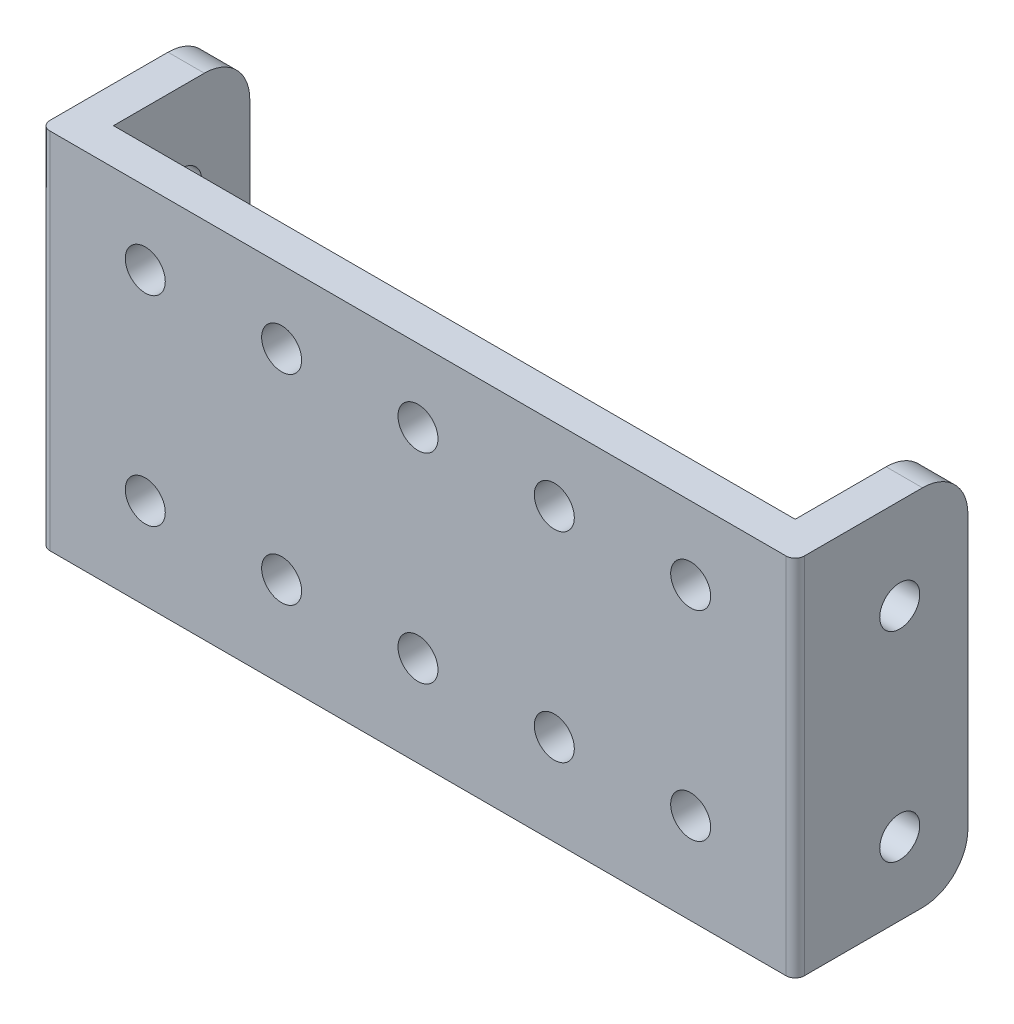
ISO-10303-21;
HEADER;
FILE_DESCRIPTION(('STEP AP214'),'2;1');
FILE_NAME('part.step','',(''),(''),'','','');
FILE_SCHEMA(('AUTOMOTIVE_DESIGN { 1 0 10303 214 1 1 1 1 }'));
ENDSEC;
DATA;
#1=APPLICATION_CONTEXT('core data for automotive mechanical design processes');
#2=APPLICATION_PROTOCOL_DEFINITION('international standard','automotive_design',2000,#1);
#3=PRODUCT_CONTEXT('',#1,'mechanical');
#4=PRODUCT('Part','Part','',(#3));
#5=PRODUCT_RELATED_PRODUCT_CATEGORY('part','',(#4));
#6=PRODUCT_DEFINITION_FORMATION('','',#4);
#7=PRODUCT_DEFINITION_CONTEXT('part definition',#1,'design');
#8=PRODUCT_DEFINITION('design','',#6,#7);
#9=PRODUCT_DEFINITION_SHAPE('','',#8);
#10=(LENGTH_UNIT() NAMED_UNIT(*) SI_UNIT(.MILLI.,.METRE.));
#11=(NAMED_UNIT(*) PLANE_ANGLE_UNIT() SI_UNIT($,.RADIAN.));
#12=(NAMED_UNIT(*) SI_UNIT($,.STERADIAN.) SOLID_ANGLE_UNIT());
#13=UNCERTAINTY_MEASURE_WITH_UNIT(LENGTH_MEASURE(1.E-05),#10,'distance_accuracy_value','');
#14=(GEOMETRIC_REPRESENTATION_CONTEXT(3) GLOBAL_UNCERTAINTY_ASSIGNED_CONTEXT((#13)) GLOBAL_UNIT_ASSIGNED_CONTEXT((#10,
#11,#12)) REPRESENTATION_CONTEXT('',''));
#15=CARTESIAN_POINT('',(0.,0.,0.));
#16=DIRECTION('',(0.,0.,1.));
#17=DIRECTION('',(1.,0.,0.));
#18=AXIS2_PLACEMENT_3D('',#15,#16,#17);
#19=CARTESIAN_POINT('',(-41.5,40.,-15.));
#20=DIRECTION('',(0.,0.,1.));
#21=DIRECTION('',(1.,0.,0.));
#22=AXIS2_PLACEMENT_3D('',#19,#20,#21);
#23=PLANE('',#22);
#24=DIRECTION('',(0.,-1.,0.));
#25=VECTOR('',#24,1.);
#26=CARTESIAN_POINT('',(-37.5,40.,-15.));
#27=LINE('',#26,#25);
#28=CARTESIAN_POINT('',(-37.5,35.,-15.));
#29=VERTEX_POINT('',#28);
#30=CARTESIAN_POINT('',(-37.5,5.,-15.));
#31=VERTEX_POINT('',#30);
#32=EDGE_CURVE('E178',#29,#31,#27,.T.);
#33=ORIENTED_EDGE('',*,*,#32,.T.);
#34=DIRECTION('',(-1.,0.,0.));
#35=VECTOR('',#34,1.);
#36=CARTESIAN_POINT('',(-41.5,5.,-15.));
#37=LINE('',#36,#35);
#38=CARTESIAN_POINT('',(-41.5,5.,-15.));
#39=VERTEX_POINT('',#38);
#40=EDGE_CURVE('E219',#31,#39,#37,.T.);
#41=ORIENTED_EDGE('',*,*,#40,.T.);
#42=DIRECTION('',(0.,-1.,0.));
#43=VECTOR('',#42,1.);
#44=CARTESIAN_POINT('',(-41.5,40.,-15.));
#45=LINE('',#44,#43);
#46=CARTESIAN_POINT('',(-41.5,35.,-15.));
#47=VERTEX_POINT('',#46);
#48=EDGE_CURVE('E156',#47,#39,#45,.T.);
#49=ORIENTED_EDGE('',*,*,#48,.F.);
#50=DIRECTION('',(-1.,0.,0.));
#51=VECTOR('',#50,1.);
#52=CARTESIAN_POINT('',(-41.5,35.,-15.));
#53=LINE('',#52,#51);
#54=EDGE_CURVE('E217',#47,#29,#53,.F.);
#55=ORIENTED_EDGE('',*,*,#54,.T.);
#56=EDGE_LOOP('',(#33,#41,#49,#55));
#57=FACE_BOUND('',#56,.T.);
#58=ADVANCED_FACE('F33',(#57),#23,.F.);
#59=CARTESIAN_POINT('',(-41.5,40.,3.00000000000001));
#60=DIRECTION('',(1.,0.,0.));
#61=DIRECTION('',(0.,0.,-1.));
#62=AXIS2_PLACEMENT_3D('',#59,#60,#61);
#63=PLANE('',#62);
#64=CARTESIAN_POINT('',(-41.5,30.,-7.49999999999999));
#65=DIRECTION('',(-1.,0.,0.));
#66=DIRECTION('',(0.,0.,1.));
#67=AXIS2_PLACEMENT_3D('',#64,#65,#66);
#68=CIRCLE('',#67,2.2);
#69=CARTESIAN_POINT('',(-41.5,30.,-5.29999999999999));
#70=VERTEX_POINT('',#69);
#71=EDGE_CURVE('E279',#70,#70,#68,.T.);
#72=ORIENTED_EDGE('',*,*,#71,.F.);
#73=EDGE_LOOP('',(#72));
#74=FACE_BOUND('',#73,.T.);
#75=CARTESIAN_POINT('',(-41.5,8.,-7.49999999999999));
#76=DIRECTION('',(-1.,0.,0.));
#77=DIRECTION('',(0.,0.,1.));
#78=AXIS2_PLACEMENT_3D('',#75,#76,#77);
#79=CIRCLE('',#78,2.2);
#80=CARTESIAN_POINT('',(-41.5,8.,-5.29999999999999));
#81=VERTEX_POINT('',#80);
#82=EDGE_CURVE('E286',#81,#81,#79,.T.);
#83=ORIENTED_EDGE('',*,*,#82,.F.);
#84=EDGE_LOOP('',(#83));
#85=FACE_BOUND('',#84,.T.);
#86=ORIENTED_EDGE('',*,*,#48,.T.);
#87=CARTESIAN_POINT('',(-41.5,5.,-9.99999999999999));
#88=DIRECTION('',(1.,0.,0.));
#89=DIRECTION('',(0.,0.,-1.));
#90=AXIS2_PLACEMENT_3D('',#87,#88,#89);
#91=CIRCLE('',#90,5.);
#92=CARTESIAN_POINT('',(-41.5,0.,-9.99999999999999));
#93=VERTEX_POINT('',#92);
#94=EDGE_CURVE('E224',#39,#93,#91,.F.);
#95=ORIENTED_EDGE('',*,*,#94,.T.);
#96=DIRECTION('',(0.,0.,1.));
#97=VECTOR('',#96,1.);
#98=CARTESIAN_POINT('',(-41.5,0.,3.00000000000001));
#99=LINE('',#98,#97);
#100=CARTESIAN_POINT('',(-41.5,0.,3.00000000000001));
#101=VERTEX_POINT('',#100);
#102=EDGE_CURVE('E153',#93,#101,#99,.T.);
#103=ORIENTED_EDGE('',*,*,#102,.T.);
#104=DIRECTION('',(0.,-1.,0.));
#105=VECTOR('',#104,1.);
#106=CARTESIAN_POINT('',(-41.5,40.,3.00000000000001));
#107=LINE('',#106,#105);
#108=CARTESIAN_POINT('',(-41.5,40.,3.00000000000001));
#109=VERTEX_POINT('',#108);
#110=EDGE_CURVE('E149',#109,#101,#107,.T.);
#111=ORIENTED_EDGE('',*,*,#110,.F.);
#112=DIRECTION('',(0.,0.,1.));
#113=VECTOR('',#112,1.);
#114=CARTESIAN_POINT('',(-41.5,40.,3.00000000000001));
#115=LINE('',#114,#113);
#116=CARTESIAN_POINT('',(-41.5,40.,-9.99999999999999));
#117=VERTEX_POINT('',#116);
#118=EDGE_CURVE('E136',#117,#109,#115,.T.);
#119=ORIENTED_EDGE('',*,*,#118,.F.);
#120=CARTESIAN_POINT('',(-41.5,35.,-9.99999999999999));
#121=DIRECTION('',(1.,0.,0.));
#122=DIRECTION('',(0.,0.,-1.));
#123=AXIS2_PLACEMENT_3D('',#120,#121,#122);
#124=CIRCLE('',#123,5.);
#125=EDGE_CURVE('E222',#117,#47,#124,.F.);
#126=ORIENTED_EDGE('',*,*,#125,.T.);
#127=EDGE_LOOP('',(#86,#95,#103,#111,#119,#126));
#128=FACE_BOUND('',#127,.T.);
#129=ADVANCED_FACE('F151',(#74,#85,#128),#63,.F.);
#130=CARTESIAN_POINT('',(-40.5,40.,3.00000000000001));
#131=DIRECTION('',(0.,-1.,0.));
#132=DIRECTION('',(0.,0.,-1.));
#133=AXIS2_PLACEMENT_3D('',#130,#131,#132);
#134=CYLINDRICAL_SURFACE('',#133,1.);
#135=CARTESIAN_POINT('',(-40.5,0.,3.00000000000001));
#136=DIRECTION('',(0.,1.,0.));
#137=DIRECTION('',(0.,0.,-1.));
#138=AXIS2_PLACEMENT_3D('',#135,#136,#137);
#139=CIRCLE('',#138,1.);
#140=CARTESIAN_POINT('',(-40.5,0.,4.00000000000001));
#141=VERTEX_POINT('',#140);
#142=EDGE_CURVE('E180',#101,#141,#139,.T.);
#143=ORIENTED_EDGE('',*,*,#142,.T.);
#144=DIRECTION('',(0.,-1.,0.));
#145=VECTOR('',#144,1.);
#146=CARTESIAN_POINT('',(-40.5,40.,4.00000000000001));
#147=LINE('',#146,#145);
#148=CARTESIAN_POINT('',(-40.5,40.,4.00000000000001));
#149=VERTEX_POINT('',#148);
#150=EDGE_CURVE('E157',#149,#141,#147,.T.);
#151=ORIENTED_EDGE('',*,*,#150,.F.);
#152=CARTESIAN_POINT('',(-40.5,40.,3.00000000000001));
#153=DIRECTION('',(0.,1.,0.));
#154=DIRECTION('',(0.,0.,-1.));
#155=AXIS2_PLACEMENT_3D('',#152,#153,#154);
#156=CIRCLE('',#155,1.);
#157=EDGE_CURVE('E141',#109,#149,#156,.T.);
#158=ORIENTED_EDGE('',*,*,#157,.F.);
#159=ORIENTED_EDGE('',*,*,#110,.T.);
#160=EDGE_LOOP('',(#143,#151,#158,#159));
#161=FACE_BOUND('',#160,.T.);
#162=ADVANCED_FACE('F159',(#161),#134,.T.);
#163=CARTESIAN_POINT('',(40.5,40.,3.99999999999998));
#164=DIRECTION('',(0.,0.,-1.));
#165=DIRECTION('',(-1.,0.,0.));
#166=AXIS2_PLACEMENT_3D('',#163,#164,#165);
#167=PLANE('',#166);
#168=CARTESIAN_POINT('',(-15.,32.,3.99999999999999));
#169=DIRECTION('',(0.,0.,1.));
#170=DIRECTION('',(1.,0.,0.));
#171=AXIS2_PLACEMENT_3D('',#168,#169,#170);
#172=CIRCLE('',#171,2.2);
#173=CARTESIAN_POINT('',(-12.8,32.,3.99999999999999));
#174=VERTEX_POINT('',#173);
#175=EDGE_CURVE('E305',#174,#174,#172,.T.);
#176=ORIENTED_EDGE('',*,*,#175,.F.);
#177=EDGE_LOOP('',(#176));
#178=FACE_BOUND('',#177,.T.);
#179=CARTESIAN_POINT('',(0.,32.,3.99999999999999));
#180=DIRECTION('',(0.,0.,1.));
#181=DIRECTION('',(1.,0.,0.));
#182=AXIS2_PLACEMENT_3D('',#179,#180,#181);
#183=CIRCLE('',#182,2.2);
#184=CARTESIAN_POINT('',(2.2,32.,3.99999999999999));
#185=VERTEX_POINT('',#184);
#186=EDGE_CURVE('E308',#185,#185,#183,.T.);
#187=ORIENTED_EDGE('',*,*,#186,.F.);
#188=EDGE_LOOP('',(#187));
#189=FACE_BOUND('',#188,.T.);
#190=CARTESIAN_POINT('',(15.,32.,3.99999999999999));
#191=DIRECTION('',(0.,0.,1.));
#192=DIRECTION('',(1.,0.,0.));
#193=AXIS2_PLACEMENT_3D('',#190,#191,#192);
#194=CIRCLE('',#193,2.2);
#195=CARTESIAN_POINT('',(17.2,32.,3.99999999999999));
#196=VERTEX_POINT('',#195);
#197=EDGE_CURVE('E311',#196,#196,#194,.T.);
#198=ORIENTED_EDGE('',*,*,#197,.F.);
#199=EDGE_LOOP('',(#198));
#200=FACE_BOUND('',#199,.T.);
#201=CARTESIAN_POINT('',(30.,32.,3.99999999999999));
#202=DIRECTION('',(0.,0.,1.));
#203=DIRECTION('',(1.,0.,0.));
#204=AXIS2_PLACEMENT_3D('',#201,#202,#203);
#205=CIRCLE('',#204,2.2);
#206=CARTESIAN_POINT('',(32.2,32.,3.99999999999999));
#207=VERTEX_POINT('',#206);
#208=EDGE_CURVE('E314',#207,#207,#205,.T.);
#209=ORIENTED_EDGE('',*,*,#208,.F.);
#210=EDGE_LOOP('',(#209));
#211=FACE_BOUND('',#210,.T.);
#212=CARTESIAN_POINT('',(-30.,10.,3.99999999999999));
#213=DIRECTION('',(0.,0.,1.));
#214=DIRECTION('',(1.,0.,0.));
#215=AXIS2_PLACEMENT_3D('',#212,#213,#214);
#216=CIRCLE('',#215,2.2);
#217=CARTESIAN_POINT('',(-27.8,10.,3.99999999999999));
#218=VERTEX_POINT('',#217);
#219=EDGE_CURVE('E317',#218,#218,#216,.T.);
#220=ORIENTED_EDGE('',*,*,#219,.F.);
#221=EDGE_LOOP('',(#220));
#222=FACE_BOUND('',#221,.T.);
#223=CARTESIAN_POINT('',(-15.,10.,3.99999999999999));
#224=DIRECTION('',(0.,0.,1.));
#225=DIRECTION('',(1.,0.,0.));
#226=AXIS2_PLACEMENT_3D('',#223,#224,#225);
#227=CIRCLE('',#226,2.2);
#228=CARTESIAN_POINT('',(-12.8,10.,3.99999999999999));
#229=VERTEX_POINT('',#228);
#230=EDGE_CURVE('E320',#229,#229,#227,.T.);
#231=ORIENTED_EDGE('',*,*,#230,.F.);
#232=EDGE_LOOP('',(#231));
#233=FACE_BOUND('',#232,.T.);
#234=CARTESIAN_POINT('',(0.,10.,3.99999999999999));
#235=DIRECTION('',(0.,0.,1.));
#236=DIRECTION('',(1.,0.,0.));
#237=AXIS2_PLACEMENT_3D('',#234,#235,#236);
#238=CIRCLE('',#237,2.2);
#239=CARTESIAN_POINT('',(2.2,10.,3.99999999999999));
#240=VERTEX_POINT('',#239);
#241=EDGE_CURVE('E323',#240,#240,#238,.T.);
#242=ORIENTED_EDGE('',*,*,#241,.F.);
#243=EDGE_LOOP('',(#242));
#244=FACE_BOUND('',#243,.T.);
#245=CARTESIAN_POINT('',(15.,10.,3.99999999999999));
#246=DIRECTION('',(0.,0.,1.));
#247=DIRECTION('',(1.,0.,0.));
#248=AXIS2_PLACEMENT_3D('',#245,#246,#247);
#249=CIRCLE('',#248,2.2);
#250=CARTESIAN_POINT('',(17.2,10.,3.99999999999999));
#251=VERTEX_POINT('',#250);
#252=EDGE_CURVE('E304',#251,#251,#249,.T.);
#253=ORIENTED_EDGE('',*,*,#252,.F.);
#254=EDGE_LOOP('',(#253));
#255=FACE_BOUND('',#254,.T.);
#256=CARTESIAN_POINT('',(30.,10.,3.99999999999999));
#257=DIRECTION('',(0.,0.,1.));
#258=DIRECTION('',(1.,0.,0.));
#259=AXIS2_PLACEMENT_3D('',#256,#257,#258);
#260=CIRCLE('',#259,2.2);
#261=CARTESIAN_POINT('',(32.2,10.,3.99999999999999));
#262=VERTEX_POINT('',#261);
#263=EDGE_CURVE('E301',#262,#262,#260,.T.);
#264=ORIENTED_EDGE('',*,*,#263,.F.);
#265=EDGE_LOOP('',(#264));
#266=FACE_BOUND('',#265,.T.);
#267=CARTESIAN_POINT('',(-30.,32.,3.99999999999999));
#268=DIRECTION('',(0.,0.,1.));
#269=DIRECTION('',(1.,0.,0.));
#270=AXIS2_PLACEMENT_3D('',#267,#268,#269);
#271=CIRCLE('',#270,2.2);
#272=CARTESIAN_POINT('',(-27.8,32.,3.99999999999999));
#273=VERTEX_POINT('',#272);
#274=EDGE_CURVE('E251',#273,#273,#271,.T.);
#275=ORIENTED_EDGE('',*,*,#274,.F.);
#276=EDGE_LOOP('',(#275));
#277=FACE_BOUND('',#276,.T.);
#278=DIRECTION('',(1.,0.,0.));
#279=VECTOR('',#278,1.);
#280=CARTESIAN_POINT('',(40.5,0.,3.99999999999998));
#281=LINE('',#280,#279);
#282=CARTESIAN_POINT('',(40.5,0.,3.99999999999998));
#283=VERTEX_POINT('',#282);
#284=EDGE_CURVE('E183',#141,#283,#281,.T.);
#285=ORIENTED_EDGE('',*,*,#284,.T.);
#286=DIRECTION('',(0.,-1.,0.));
#287=VECTOR('',#286,1.);
#288=CARTESIAN_POINT('',(40.5,40.,3.99999999999998));
#289=LINE('',#288,#287);
#290=CARTESIAN_POINT('',(40.5,40.,3.99999999999998));
#291=VERTEX_POINT('',#290);
#292=EDGE_CURVE('E212',#291,#283,#289,.T.);
#293=ORIENTED_EDGE('',*,*,#292,.F.);
#294=DIRECTION('',(1.,0.,0.));
#295=VECTOR('',#294,1.);
#296=CARTESIAN_POINT('',(40.5,40.,3.99999999999998));
#297=LINE('',#296,#295);
#298=EDGE_CURVE('E162',#149,#291,#297,.T.);
#299=ORIENTED_EDGE('',*,*,#298,.F.);
#300=ORIENTED_EDGE('',*,*,#150,.T.);
#301=EDGE_LOOP('',(#285,#293,#299,#300));
#302=FACE_BOUND('',#301,.T.);
#303=ADVANCED_FACE('F333',(#178,#189,#200,#211,#222,#233,#244,#255,#266,#277,#302),#167,.F.);
#304=CARTESIAN_POINT('',(40.5,40.,2.99999999999998));
#305=DIRECTION('',(0.,-1.,0.));
#306=DIRECTION('',(0.,0.,-1.));
#307=AXIS2_PLACEMENT_3D('',#304,#305,#306);
#308=CYLINDRICAL_SURFACE('',#307,1.);
#309=CARTESIAN_POINT('',(40.5,0.,2.99999999999998));
#310=DIRECTION('',(0.,1.,0.));
#311=DIRECTION('',(0.,0.,-1.));
#312=AXIS2_PLACEMENT_3D('',#309,#310,#311);
#313=CIRCLE('',#312,1.);
#314=CARTESIAN_POINT('',(41.5,0.,2.99999999999998));
#315=VERTEX_POINT('',#314);
#316=EDGE_CURVE('E185',#283,#315,#313,.T.);
#317=ORIENTED_EDGE('',*,*,#316,.T.);
#318=DIRECTION('',(0.,-1.,0.));
#319=VECTOR('',#318,1.);
#320=CARTESIAN_POINT('',(41.5,40.,2.99999999999998));
#321=LINE('',#320,#319);
#322=CARTESIAN_POINT('',(41.5,40.,2.99999999999998));
#323=VERTEX_POINT('',#322);
#324=EDGE_CURVE('E209',#323,#315,#321,.T.);
#325=ORIENTED_EDGE('',*,*,#324,.F.);
#326=CARTESIAN_POINT('',(40.5,40.,2.99999999999998));
#327=DIRECTION('',(0.,1.,0.));
#328=DIRECTION('',(0.,0.,-1.));
#329=AXIS2_PLACEMENT_3D('',#326,#327,#328);
#330=CIRCLE('',#329,1.);
#331=EDGE_CURVE('E164',#291,#323,#330,.T.);
#332=ORIENTED_EDGE('',*,*,#331,.F.);
#333=ORIENTED_EDGE('',*,*,#292,.T.);
#334=EDGE_LOOP('',(#317,#325,#332,#333));
#335=FACE_BOUND('',#334,.T.);
#336=ADVANCED_FACE('F336',(#335),#308,.T.);
#337=CARTESIAN_POINT('',(41.5,40.,2.99999999999998));
#338=DIRECTION('',(-1.,0.,0.));
#339=DIRECTION('',(0.,0.,1.));
#340=AXIS2_PLACEMENT_3D('',#337,#338,#339);
#341=PLANE('',#340);
#342=CARTESIAN_POINT('',(41.5,30.,-7.49999999999999));
#343=DIRECTION('',(-1.,0.,0.));
#344=DIRECTION('',(0.,0.,1.));
#345=AXIS2_PLACEMENT_3D('',#342,#343,#344);
#346=CIRCLE('',#345,2.2);
#347=CARTESIAN_POINT('',(41.5,30.,-5.29999999999999));
#348=VERTEX_POINT('',#347);
#349=EDGE_CURVE('E298',#348,#348,#346,.T.);
#350=ORIENTED_EDGE('',*,*,#349,.T.);
#351=EDGE_LOOP('',(#350));
#352=FACE_BOUND('',#351,.T.);
#353=CARTESIAN_POINT('',(41.5,8.,-7.49999999999999));
#354=DIRECTION('',(-1.,0.,0.));
#355=DIRECTION('',(0.,0.,1.));
#356=AXIS2_PLACEMENT_3D('',#353,#354,#355);
#357=CIRCLE('',#356,2.2);
#358=CARTESIAN_POINT('',(41.5,8.,-5.29999999999999));
#359=VERTEX_POINT('',#358);
#360=EDGE_CURVE('E283',#359,#359,#357,.T.);
#361=ORIENTED_EDGE('',*,*,#360,.T.);
#362=EDGE_LOOP('',(#361));
#363=FACE_BOUND('',#362,.T.);
#364=DIRECTION('',(0.,0.,-1.));
#365=VECTOR('',#364,1.);
#366=CARTESIAN_POINT('',(41.5,0.,2.99999999999998));
#367=LINE('',#366,#365);
#368=CARTESIAN_POINT('',(41.5,0.,-9.99999999999999));
#369=VERTEX_POINT('',#368);
#370=EDGE_CURVE('E187',#315,#369,#367,.T.);
#371=ORIENTED_EDGE('',*,*,#370,.T.);
#372=CARTESIAN_POINT('',(41.5,5.,-9.99999999999999));
#373=DIRECTION('',(-1.,0.,0.));
#374=DIRECTION('',(0.,0.,1.));
#375=AXIS2_PLACEMENT_3D('',#372,#373,#374);
#376=CIRCLE('',#375,5.);
#377=CARTESIAN_POINT('',(41.5,5.,-15.));
#378=VERTEX_POINT('',#377);
#379=EDGE_CURVE('E11',#369,#378,#376,.F.);
#380=ORIENTED_EDGE('',*,*,#379,.T.);
#381=DIRECTION('',(0.,-1.,0.));
#382=VECTOR('',#381,1.);
#383=CARTESIAN_POINT('',(41.5,40.,-15.));
#384=LINE('',#383,#382);
#385=CARTESIAN_POINT('',(41.5,35.,-15.));
#386=VERTEX_POINT('',#385);
#387=EDGE_CURVE('E207',#386,#378,#384,.T.);
#388=ORIENTED_EDGE('',*,*,#387,.F.);
#389=CARTESIAN_POINT('',(41.5,35.,-9.99999999999999));
#390=DIRECTION('',(-1.,0.,0.));
#391=DIRECTION('',(0.,0.,1.));
#392=AXIS2_PLACEMENT_3D('',#389,#390,#391);
#393=CIRCLE('',#392,5.);
#394=CARTESIAN_POINT('',(41.5,40.,-9.99999999999999));
#395=VERTEX_POINT('',#394);
#396=EDGE_CURVE('E42',#386,#395,#393,.F.);
#397=ORIENTED_EDGE('',*,*,#396,.T.);
#398=DIRECTION('',(0.,0.,-1.));
#399=VECTOR('',#398,1.);
#400=CARTESIAN_POINT('',(41.5,40.,2.99999999999998));
#401=LINE('',#400,#399);
#402=EDGE_CURVE('E169',#323,#395,#401,.T.);
#403=ORIENTED_EDGE('',*,*,#402,.F.);
#404=ORIENTED_EDGE('',*,*,#324,.T.);
#405=EDGE_LOOP('',(#371,#380,#388,#397,#403,#404));
#406=FACE_BOUND('',#405,.T.);
#407=ADVANCED_FACE('F350',(#352,#363,#406),#341,.F.);
#408=CARTESIAN_POINT('',(37.5,40.,-15.));
#409=DIRECTION('',(0.,0.,1.));
#410=DIRECTION('',(1.,0.,0.));
#411=AXIS2_PLACEMENT_3D('',#408,#409,#410);
#412=PLANE('',#411);
#413=ORIENTED_EDGE('',*,*,#387,.T.);
#414=DIRECTION('',(-1.,0.,0.));
#415=VECTOR('',#414,1.);
#416=CARTESIAN_POINT('',(37.5,5.,-15.));
#417=LINE('',#416,#415);
#418=CARTESIAN_POINT('',(37.5,5.,-15.));
#419=VERTEX_POINT('',#418);
#420=EDGE_CURVE('E239',#378,#419,#417,.T.);
#421=ORIENTED_EDGE('',*,*,#420,.T.);
#422=DIRECTION('',(0.,-1.,0.));
#423=VECTOR('',#422,1.);
#424=CARTESIAN_POINT('',(37.5,40.,-15.));
#425=LINE('',#424,#423);
#426=CARTESIAN_POINT('',(37.5,35.,-15.));
#427=VERTEX_POINT('',#426);
#428=EDGE_CURVE('E204',#427,#419,#425,.T.);
#429=ORIENTED_EDGE('',*,*,#428,.F.);
#430=DIRECTION('',(-1.,0.,0.));
#431=VECTOR('',#430,1.);
#432=CARTESIAN_POINT('',(37.5,35.,-15.));
#433=LINE('',#432,#431);
#434=EDGE_CURVE('E55',#427,#386,#433,.F.);
#435=ORIENTED_EDGE('',*,*,#434,.T.);
#436=EDGE_LOOP('',(#413,#421,#429,#435));
#437=FACE_BOUND('',#436,.T.);
#438=ADVANCED_FACE('F355',(#437),#412,.F.);
#439=CARTESIAN_POINT('',(37.5,40.,0.));
#440=DIRECTION('',(1.,0.,0.));
#441=DIRECTION('',(0.,0.,-1.));
#442=AXIS2_PLACEMENT_3D('',#439,#440,#441);
#443=PLANE('',#442);
#444=CARTESIAN_POINT('',(37.5,30.,-7.49999999999999));
#445=DIRECTION('',(1.,0.,0.));
#446=DIRECTION('',(0.,0.,-1.));
#447=AXIS2_PLACEMENT_3D('',#444,#445,#446);
#448=CIRCLE('',#447,2.2);
#449=CARTESIAN_POINT('',(37.5,30.,-9.69999999999999));
#450=VERTEX_POINT('',#449);
#451=EDGE_CURVE('E295',#450,#450,#448,.T.);
#452=ORIENTED_EDGE('',*,*,#451,.T.);
#453=EDGE_LOOP('',(#452));
#454=FACE_BOUND('',#453,.T.);
#455=CARTESIAN_POINT('',(37.5,8.,-7.49999999999999));
#456=DIRECTION('',(1.,0.,0.));
#457=DIRECTION('',(0.,0.,-1.));
#458=AXIS2_PLACEMENT_3D('',#455,#456,#457);
#459=CIRCLE('',#458,2.2);
#460=CARTESIAN_POINT('',(37.5,8.,-9.69999999999999));
#461=VERTEX_POINT('',#460);
#462=EDGE_CURVE('E278',#461,#461,#459,.T.);
#463=ORIENTED_EDGE('',*,*,#462,.T.);
#464=EDGE_LOOP('',(#463));
#465=FACE_BOUND('',#464,.T.);
#466=ORIENTED_EDGE('',*,*,#428,.T.);
#467=CARTESIAN_POINT('',(37.5,5.,-9.99999999999999));
#468=DIRECTION('',(1.,0.,0.));
#469=DIRECTION('',(0.,0.,-1.));
#470=AXIS2_PLACEMENT_3D('',#467,#468,#469);
#471=CIRCLE('',#470,5.);
#472=CARTESIAN_POINT('',(37.5,0.,-9.99999999999999));
#473=VERTEX_POINT('',#472);
#474=EDGE_CURVE('E244',#419,#473,#471,.F.);
#475=ORIENTED_EDGE('',*,*,#474,.T.);
#476=DIRECTION('',(0.,0.,1.));
#477=VECTOR('',#476,1.);
#478=CARTESIAN_POINT('',(37.5,0.,0.));
#479=LINE('',#478,#477);
#480=CARTESIAN_POINT('',(37.5,0.,0.));
#481=VERTEX_POINT('',#480);
#482=EDGE_CURVE('E189',#473,#481,#479,.T.);
#483=ORIENTED_EDGE('',*,*,#482,.T.);
#484=DIRECTION('',(0.,-1.,0.));
#485=VECTOR('',#484,1.);
#486=CARTESIAN_POINT('',(37.5,40.,0.));
#487=LINE('',#486,#485);
#488=CARTESIAN_POINT('',(37.5,40.,0.));
#489=VERTEX_POINT('',#488);
#490=EDGE_CURVE('E201',#489,#481,#487,.T.);
#491=ORIENTED_EDGE('',*,*,#490,.F.);
#492=DIRECTION('',(0.,0.,1.));
#493=VECTOR('',#492,1.);
#494=CARTESIAN_POINT('',(37.5,40.,-1.00000000000001));
#495=LINE('',#494,#493);
#496=CARTESIAN_POINT('',(37.5,40.,-9.99999999999999));
#497=VERTEX_POINT('',#496);
#498=EDGE_CURVE('E172',#497,#489,#495,.T.);
#499=ORIENTED_EDGE('',*,*,#498,.F.);
#500=CARTESIAN_POINT('',(37.5,35.,-9.99999999999999));
#501=DIRECTION('',(1.,0.,0.));
#502=DIRECTION('',(0.,0.,-1.));
#503=AXIS2_PLACEMENT_3D('',#500,#501,#502);
#504=CIRCLE('',#503,5.);
#505=EDGE_CURVE('E242',#497,#427,#504,.F.);
#506=ORIENTED_EDGE('',*,*,#505,.T.);
#507=EDGE_LOOP('',(#466,#475,#483,#491,#499,#506));
#508=FACE_BOUND('',#507,.T.);
#509=ADVANCED_FACE('F357',(#454,#465,#508),#443,.F.);
#510=CARTESIAN_POINT('',(-37.5,40.,0.));
#511=DIRECTION('',(0.,0.,1.));
#512=DIRECTION('',(1.,0.,0.));
#513=AXIS2_PLACEMENT_3D('',#510,#511,#512);
#514=PLANE('',#513);
#515=CARTESIAN_POINT('',(-15.,32.,0.));
#516=DIRECTION('',(0.,0.,1.));
#517=DIRECTION('',(1.,0.,0.));
#518=AXIS2_PLACEMENT_3D('',#515,#516,#517);
#519=CIRCLE('',#518,2.2);
#520=CARTESIAN_POINT('',(-12.8,32.,0.));
#521=VERTEX_POINT('',#520);
#522=EDGE_CURVE('E181',#521,#521,#519,.T.);
#523=ORIENTED_EDGE('',*,*,#522,.T.);
#524=EDGE_LOOP('',(#523));
#525=FACE_BOUND('',#524,.T.);
#526=CARTESIAN_POINT('',(0.,32.,0.));
#527=DIRECTION('',(0.,0.,1.));
#528=DIRECTION('',(1.,0.,0.));
#529=AXIS2_PLACEMENT_3D('',#526,#527,#528);
#530=CIRCLE('',#529,2.2);
#531=CARTESIAN_POINT('',(2.2,32.,0.));
#532=VERTEX_POINT('',#531);
#533=EDGE_CURVE('E272',#532,#532,#530,.T.);
#534=ORIENTED_EDGE('',*,*,#533,.T.);
#535=EDGE_LOOP('',(#534));
#536=FACE_BOUND('',#535,.T.);
#537=CARTESIAN_POINT('',(15.,32.,0.));
#538=DIRECTION('',(0.,0.,1.));
#539=DIRECTION('',(1.,0.,0.));
#540=AXIS2_PLACEMENT_3D('',#537,#538,#539);
#541=CIRCLE('',#540,2.2);
#542=CARTESIAN_POINT('',(17.2,32.,0.));
#543=VERTEX_POINT('',#542);
#544=EDGE_CURVE('E269',#543,#543,#541,.T.);
#545=ORIENTED_EDGE('',*,*,#544,.T.);
#546=EDGE_LOOP('',(#545));
#547=FACE_BOUND('',#546,.T.);
#548=CARTESIAN_POINT('',(30.,32.,0.));
#549=DIRECTION('',(0.,0.,1.));
#550=DIRECTION('',(1.,0.,0.));
#551=AXIS2_PLACEMENT_3D('',#548,#549,#550);
#552=CIRCLE('',#551,2.2);
#553=CARTESIAN_POINT('',(32.2,32.,0.));
#554=VERTEX_POINT('',#553);
#555=EDGE_CURVE('E266',#554,#554,#552,.T.);
#556=ORIENTED_EDGE('',*,*,#555,.T.);
#557=EDGE_LOOP('',(#556));
#558=FACE_BOUND('',#557,.T.);
#559=CARTESIAN_POINT('',(-30.,10.,0.));
#560=DIRECTION('',(0.,0.,1.));
#561=DIRECTION('',(1.,0.,0.));
#562=AXIS2_PLACEMENT_3D('',#559,#560,#561);
#563=CIRCLE('',#562,2.2);
#564=CARTESIAN_POINT('',(-27.8,10.,0.));
#565=VERTEX_POINT('',#564);
#566=EDGE_CURVE('E263',#565,#565,#563,.T.);
#567=ORIENTED_EDGE('',*,*,#566,.T.);
#568=EDGE_LOOP('',(#567));
#569=FACE_BOUND('',#568,.T.);
#570=CARTESIAN_POINT('',(-15.,10.,0.));
#571=DIRECTION('',(0.,0.,1.));
#572=DIRECTION('',(1.,0.,0.));
#573=AXIS2_PLACEMENT_3D('',#570,#571,#572);
#574=CIRCLE('',#573,2.2);
#575=CARTESIAN_POINT('',(-12.8,10.,0.));
#576=VERTEX_POINT('',#575);
#577=EDGE_CURVE('E260',#576,#576,#574,.T.);
#578=ORIENTED_EDGE('',*,*,#577,.T.);
#579=EDGE_LOOP('',(#578));
#580=FACE_BOUND('',#579,.T.);
#581=CARTESIAN_POINT('',(0.,10.,0.));
#582=DIRECTION('',(0.,0.,1.));
#583=DIRECTION('',(1.,0.,0.));
#584=AXIS2_PLACEMENT_3D('',#581,#582,#583);
#585=CIRCLE('',#584,2.2);
#586=CARTESIAN_POINT('',(2.2,10.,0.));
#587=VERTEX_POINT('',#586);
#588=EDGE_CURVE('E257',#587,#587,#585,.T.);
#589=ORIENTED_EDGE('',*,*,#588,.T.);
#590=EDGE_LOOP('',(#589));
#591=FACE_BOUND('',#590,.T.);
#592=CARTESIAN_POINT('',(15.,10.,0.));
#593=DIRECTION('',(0.,0.,1.));
#594=DIRECTION('',(1.,0.,0.));
#595=AXIS2_PLACEMENT_3D('',#592,#593,#594);
#596=CIRCLE('',#595,2.2);
#597=CARTESIAN_POINT('',(17.2,10.,0.));
#598=VERTEX_POINT('',#597);
#599=EDGE_CURVE('E254',#598,#598,#596,.T.);
#600=ORIENTED_EDGE('',*,*,#599,.T.);
#601=EDGE_LOOP('',(#600));
#602=FACE_BOUND('',#601,.T.);
#603=CARTESIAN_POINT('',(30.,10.,0.));
#604=DIRECTION('',(0.,0.,1.));
#605=DIRECTION('',(1.,0.,0.));
#606=AXIS2_PLACEMENT_3D('',#603,#604,#605);
#607=CIRCLE('',#606,2.2);
#608=CARTESIAN_POINT('',(32.2,10.,0.));
#609=VERTEX_POINT('',#608);
#610=EDGE_CURVE('E250',#609,#609,#607,.T.);
#611=ORIENTED_EDGE('',*,*,#610,.T.);
#612=EDGE_LOOP('',(#611));
#613=FACE_BOUND('',#612,.T.);
#614=CARTESIAN_POINT('',(-30.,32.,0.));
#615=DIRECTION('',(0.,0.,1.));
#616=DIRECTION('',(1.,0.,0.));
#617=AXIS2_PLACEMENT_3D('',#614,#615,#616);
#618=CIRCLE('',#617,2.2);
#619=CARTESIAN_POINT('',(-27.8,32.,0.));
#620=VERTEX_POINT('',#619);
#621=EDGE_CURVE('E247',#620,#620,#618,.T.);
#622=ORIENTED_EDGE('',*,*,#621,.T.);
#623=EDGE_LOOP('',(#622));
#624=FACE_BOUND('',#623,.T.);
#625=DIRECTION('',(-1.,0.,0.));
#626=VECTOR('',#625,1.);
#627=CARTESIAN_POINT('',(-37.5,0.,0.));
#628=LINE('',#627,#626);
#629=CARTESIAN_POINT('',(-37.5,0.,0.));
#630=VERTEX_POINT('',#629);
#631=EDGE_CURVE('E191',#481,#630,#628,.T.);
#632=ORIENTED_EDGE('',*,*,#631,.T.);
#633=DIRECTION('',(0.,-1.,0.));
#634=VECTOR('',#633,1.);
#635=CARTESIAN_POINT('',(-37.5,40.,0.));
#636=LINE('',#635,#634);
#637=CARTESIAN_POINT('',(-37.5,40.,0.));
#638=VERTEX_POINT('',#637);
#639=EDGE_CURVE('E198',#638,#630,#636,.T.);
#640=ORIENTED_EDGE('',*,*,#639,.F.);
#641=DIRECTION('',(-1.,0.,0.));
#642=VECTOR('',#641,1.);
#643=CARTESIAN_POINT('',(36.5,40.,0.));
#644=LINE('',#643,#642);
#645=EDGE_CURVE('E174',#489,#638,#644,.T.);
#646=ORIENTED_EDGE('',*,*,#645,.F.);
#647=ORIENTED_EDGE('',*,*,#490,.T.);
#648=EDGE_LOOP('',(#632,#640,#646,#647));
#649=FACE_BOUND('',#648,.T.);
#650=ADVANCED_FACE('F367',(#525,#536,#547,#558,#569,#580,#591,#602,#613,#624,#649),#514,.F.);
#651=CARTESIAN_POINT('',(-37.5,40.,-0.99999999999999));
#652=DIRECTION('',(-1.,0.,0.));
#653=DIRECTION('',(0.,0.,1.));
#654=AXIS2_PLACEMENT_3D('',#651,#652,#653);
#655=PLANE('',#654);
#656=CARTESIAN_POINT('',(-37.5,30.,-7.49999999999999));
#657=DIRECTION('',(-1.,0.,0.));
#658=DIRECTION('',(0.,0.,1.));
#659=AXIS2_PLACEMENT_3D('',#656,#657,#658);
#660=CIRCLE('',#659,2.2);
#661=CARTESIAN_POINT('',(-37.5,30.,-5.29999999999999));
#662=VERTEX_POINT('',#661);
#663=EDGE_CURVE('E37',#662,#662,#660,.T.);
#664=ORIENTED_EDGE('',*,*,#663,.T.);
#665=EDGE_LOOP('',(#664));
#666=FACE_BOUND('',#665,.T.);
#667=CARTESIAN_POINT('',(-37.5,8.,-7.49999999999999));
#668=DIRECTION('',(-1.,0.,0.));
#669=DIRECTION('',(0.,0.,1.));
#670=AXIS2_PLACEMENT_3D('',#667,#668,#669);
#671=CIRCLE('',#670,2.2);
#672=CARTESIAN_POINT('',(-37.5,8.,-5.29999999999999));
#673=VERTEX_POINT('',#672);
#674=EDGE_CURVE('E276',#673,#673,#671,.T.);
#675=ORIENTED_EDGE('',*,*,#674,.T.);
#676=EDGE_LOOP('',(#675));
#677=FACE_BOUND('',#676,.T.);
#678=DIRECTION('',(0.,0.,-1.));
#679=VECTOR('',#678,1.);
#680=CARTESIAN_POINT('',(-37.5,0.,-0.99999999999999));
#681=LINE('',#680,#679);
#682=CARTESIAN_POINT('',(-37.5,0.,-9.99999999999999));
#683=VERTEX_POINT('',#682);
#684=EDGE_CURVE('E146',#630,#683,#681,.T.);
#685=ORIENTED_EDGE('',*,*,#684,.T.);
#686=CARTESIAN_POINT('',(-37.5,5.,-9.99999999999999));
#687=DIRECTION('',(-1.,0.,0.));
#688=DIRECTION('',(0.,0.,1.));
#689=AXIS2_PLACEMENT_3D('',#686,#687,#688);
#690=CIRCLE('',#689,5.);
#691=EDGE_CURVE('E232',#683,#31,#690,.F.);
#692=ORIENTED_EDGE('',*,*,#691,.T.);
#693=ORIENTED_EDGE('',*,*,#32,.F.);
#694=CARTESIAN_POINT('',(-37.5,35.,-9.99999999999999));
#695=DIRECTION('',(-1.,0.,0.));
#696=DIRECTION('',(0.,0.,1.));
#697=AXIS2_PLACEMENT_3D('',#694,#695,#696);
#698=CIRCLE('',#697,5.);
#699=CARTESIAN_POINT('',(-37.5,40.,-9.99999999999999));
#700=VERTEX_POINT('',#699);
#701=EDGE_CURVE('E230',#29,#700,#698,.F.);
#702=ORIENTED_EDGE('',*,*,#701,.T.);
#703=DIRECTION('',(0.,0.,-1.));
#704=VECTOR('',#703,1.);
#705=CARTESIAN_POINT('',(-37.5,40.,-0.99999999999999));
#706=LINE('',#705,#704);
#707=EDGE_CURVE('E176',#638,#700,#706,.T.);
#708=ORIENTED_EDGE('',*,*,#707,.F.);
#709=ORIENTED_EDGE('',*,*,#639,.T.);
#710=EDGE_LOOP('',(#685,#692,#693,#702,#708,#709));
#711=FACE_BOUND('',#710,.T.);
#712=ADVANCED_FACE('F370',(#666,#677,#711),#655,.F.);
#713=CARTESIAN_POINT('',(40.5,40.,2.99999999999998));
#714=DIRECTION('',(0.,-1.,0.));
#715=DIRECTION('',(0.,0.,-1.));
#716=AXIS2_PLACEMENT_3D('',#713,#714,#715);
#717=PLANE('',#716);
#718=ORIENTED_EDGE('',*,*,#707,.T.);
#719=DIRECTION('',(-1.,0.,0.));
#720=VECTOR('',#719,1.);
#721=CARTESIAN_POINT('',(40.5,40.,-9.99999999999999));
#722=LINE('',#721,#720);
#723=EDGE_CURVE('E144',#700,#117,#722,.T.);
#724=ORIENTED_EDGE('',*,*,#723,.T.);
#725=ORIENTED_EDGE('',*,*,#118,.T.);
#726=ORIENTED_EDGE('',*,*,#157,.T.);
#727=ORIENTED_EDGE('',*,*,#298,.T.);
#728=ORIENTED_EDGE('',*,*,#331,.T.);
#729=ORIENTED_EDGE('',*,*,#402,.T.);
#730=DIRECTION('',(-1.,0.,0.));
#731=VECTOR('',#730,1.);
#732=CARTESIAN_POINT('',(40.5,40.,-9.99999999999999));
#733=LINE('',#732,#731);
#734=EDGE_CURVE('E234',#395,#497,#733,.T.);
#735=ORIENTED_EDGE('',*,*,#734,.T.);
#736=ORIENTED_EDGE('',*,*,#498,.T.);
#737=ORIENTED_EDGE('',*,*,#645,.T.);
#738=EDGE_LOOP('',(#718,#724,#725,#726,#727,#728,#729,#735,#736,#737));
#739=FACE_BOUND('',#738,.T.);
#740=ADVANCED_FACE('F139',(#739),#717,.F.);
#741=CARTESIAN_POINT('',(40.5,0.,2.99999999999998));
#742=DIRECTION('',(0.,-1.,0.));
#743=DIRECTION('',(0.,0.,-1.));
#744=AXIS2_PLACEMENT_3D('',#741,#742,#743);
#745=PLANE('',#744);
#746=ORIENTED_EDGE('',*,*,#102,.F.);
#747=DIRECTION('',(-1.,0.,0.));
#748=VECTOR('',#747,1.);
#749=CARTESIAN_POINT('',(-37.5,0.,-9.99999999999999));
#750=LINE('',#749,#748);
#751=EDGE_CURVE('E228',#93,#683,#750,.F.);
#752=ORIENTED_EDGE('',*,*,#751,.T.);
#753=ORIENTED_EDGE('',*,*,#684,.F.);
#754=ORIENTED_EDGE('',*,*,#631,.F.);
#755=ORIENTED_EDGE('',*,*,#482,.F.);
#756=DIRECTION('',(-1.,0.,0.));
#757=VECTOR('',#756,1.);
#758=CARTESIAN_POINT('',(41.5,0.,-9.99999999999999));
#759=LINE('',#758,#757);
#760=EDGE_CURVE('E226',#473,#369,#759,.F.);
#761=ORIENTED_EDGE('',*,*,#760,.T.);
#762=ORIENTED_EDGE('',*,*,#370,.F.);
#763=ORIENTED_EDGE('',*,*,#316,.F.);
#764=ORIENTED_EDGE('',*,*,#284,.F.);
#765=ORIENTED_EDGE('',*,*,#142,.F.);
#766=EDGE_LOOP('',(#746,#752,#753,#754,#755,#761,#762,#763,#764,#765));
#767=FACE_BOUND('',#766,.T.);
#768=ADVANCED_FACE('F347',(#767),#745,.T.);
#769=CARTESIAN_POINT('',(-41.5,5.,-9.99999999999999));
#770=DIRECTION('',(1.,0.,0.));
#771=DIRECTION('',(0.,0.,-1.));
#772=AXIS2_PLACEMENT_3D('',#769,#770,#771);
#773=CYLINDRICAL_SURFACE('',#772,5.);
#774=ORIENTED_EDGE('',*,*,#691,.F.);
#775=ORIENTED_EDGE('',*,*,#751,.F.);
#776=ORIENTED_EDGE('',*,*,#94,.F.);
#777=ORIENTED_EDGE('',*,*,#40,.F.);
#778=EDGE_LOOP('',(#774,#775,#776,#777));
#779=FACE_BOUND('',#778,.T.);
#780=ADVANCED_FACE('F381',(#779),#773,.T.);
#781=CARTESIAN_POINT('',(40.5,35.,-9.99999999999999));
#782=DIRECTION('',(-1.,0.,0.));
#783=DIRECTION('',(0.,0.,1.));
#784=AXIS2_PLACEMENT_3D('',#781,#782,#783);
#785=CYLINDRICAL_SURFACE('',#784,5.);
#786=ORIENTED_EDGE('',*,*,#701,.F.);
#787=ORIENTED_EDGE('',*,*,#54,.F.);
#788=ORIENTED_EDGE('',*,*,#125,.F.);
#789=ORIENTED_EDGE('',*,*,#723,.F.);
#790=EDGE_LOOP('',(#786,#787,#788,#789));
#791=FACE_BOUND('',#790,.T.);
#792=ADVANCED_FACE('F374',(#791),#785,.T.);
#793=CARTESIAN_POINT('',(37.5,5.,-9.99999999999999));
#794=DIRECTION('',(1.,0.,0.));
#795=DIRECTION('',(0.,0.,-1.));
#796=AXIS2_PLACEMENT_3D('',#793,#794,#795);
#797=CYLINDRICAL_SURFACE('',#796,5.);
#798=ORIENTED_EDGE('',*,*,#379,.F.);
#799=ORIENTED_EDGE('',*,*,#760,.F.);
#800=ORIENTED_EDGE('',*,*,#474,.F.);
#801=ORIENTED_EDGE('',*,*,#420,.F.);
#802=EDGE_LOOP('',(#798,#799,#800,#801));
#803=FACE_BOUND('',#802,.T.);
#804=ADVANCED_FACE('F354',(#803),#797,.T.);
#805=CARTESIAN_POINT('',(40.5,35.,-9.99999999999999));
#806=DIRECTION('',(-1.,0.,0.));
#807=DIRECTION('',(0.,0.,1.));
#808=AXIS2_PLACEMENT_3D('',#805,#806,#807);
#809=CYLINDRICAL_SURFACE('',#808,5.);
#810=ORIENTED_EDGE('',*,*,#396,.F.);
#811=ORIENTED_EDGE('',*,*,#434,.F.);
#812=ORIENTED_EDGE('',*,*,#505,.F.);
#813=ORIENTED_EDGE('',*,*,#734,.F.);
#814=EDGE_LOOP('',(#810,#811,#812,#813));
#815=FACE_BOUND('',#814,.T.);
#816=ADVANCED_FACE('F35',(#815),#809,.T.);
#817=CARTESIAN_POINT('',(-30.,32.,-36.));
#818=DIRECTION('',(0.,0.,1.));
#819=DIRECTION('',(1.,0.,0.));
#820=AXIS2_PLACEMENT_3D('',#817,#818,#819);
#821=CYLINDRICAL_SURFACE('',#820,2.2);
#822=ORIENTED_EDGE('',*,*,#274,.T.);
#823=EDGE_LOOP('',(#822));
#824=FACE_BOUND('',#823,.T.);
#825=ORIENTED_EDGE('',*,*,#621,.F.);
#826=EDGE_LOOP('',(#825));
#827=FACE_BOUND('',#826,.T.);
#828=ADVANCED_FACE('F330',(#824,#827),#821,.F.);
#829=CARTESIAN_POINT('',(30.,10.,-36.));
#830=DIRECTION('',(0.,0.,1.));
#831=DIRECTION('',(1.,0.,0.));
#832=AXIS2_PLACEMENT_3D('',#829,#830,#831);
#833=CYLINDRICAL_SURFACE('',#832,2.2);
#834=ORIENTED_EDGE('',*,*,#263,.T.);
#835=EDGE_LOOP('',(#834));
#836=FACE_BOUND('',#835,.T.);
#837=ORIENTED_EDGE('',*,*,#610,.F.);
#838=EDGE_LOOP('',(#837));
#839=FACE_BOUND('',#838,.T.);
#840=ADVANCED_FACE('F421',(#836,#839),#833,.F.);
#841=CARTESIAN_POINT('',(15.,10.,-36.));
#842=DIRECTION('',(0.,0.,1.));
#843=DIRECTION('',(1.,0.,0.));
#844=AXIS2_PLACEMENT_3D('',#841,#842,#843);
#845=CYLINDRICAL_SURFACE('',#844,2.2);
#846=ORIENTED_EDGE('',*,*,#252,.T.);
#847=EDGE_LOOP('',(#846));
#848=FACE_BOUND('',#847,.T.);
#849=ORIENTED_EDGE('',*,*,#599,.F.);
#850=EDGE_LOOP('',(#849));
#851=FACE_BOUND('',#850,.T.);
#852=ADVANCED_FACE('F422',(#848,#851),#845,.F.);
#853=CARTESIAN_POINT('',(0.,10.,-36.));
#854=DIRECTION('',(0.,0.,1.));
#855=DIRECTION('',(1.,0.,0.));
#856=AXIS2_PLACEMENT_3D('',#853,#854,#855);
#857=CYLINDRICAL_SURFACE('',#856,2.2);
#858=ORIENTED_EDGE('',*,*,#241,.T.);
#859=EDGE_LOOP('',(#858));
#860=FACE_BOUND('',#859,.T.);
#861=ORIENTED_EDGE('',*,*,#588,.F.);
#862=EDGE_LOOP('',(#861));
#863=FACE_BOUND('',#862,.T.);
#864=ADVANCED_FACE('F425',(#860,#863),#857,.F.);
#865=CARTESIAN_POINT('',(-15.,10.,-36.));
#866=DIRECTION('',(0.,0.,1.));
#867=DIRECTION('',(1.,0.,0.));
#868=AXIS2_PLACEMENT_3D('',#865,#866,#867);
#869=CYLINDRICAL_SURFACE('',#868,2.2);
#870=ORIENTED_EDGE('',*,*,#230,.T.);
#871=EDGE_LOOP('',(#870));
#872=FACE_BOUND('',#871,.T.);
#873=ORIENTED_EDGE('',*,*,#577,.F.);
#874=EDGE_LOOP('',(#873));
#875=FACE_BOUND('',#874,.T.);
#876=ADVANCED_FACE('F429',(#872,#875),#869,.F.);
#877=CARTESIAN_POINT('',(-30.,10.,-36.));
#878=DIRECTION('',(0.,0.,1.));
#879=DIRECTION('',(1.,0.,0.));
#880=AXIS2_PLACEMENT_3D('',#877,#878,#879);
#881=CYLINDRICAL_SURFACE('',#880,2.2);
#882=ORIENTED_EDGE('',*,*,#219,.T.);
#883=EDGE_LOOP('',(#882));
#884=FACE_BOUND('',#883,.T.);
#885=ORIENTED_EDGE('',*,*,#566,.F.);
#886=EDGE_LOOP('',(#885));
#887=FACE_BOUND('',#886,.T.);
#888=ADVANCED_FACE('F433',(#884,#887),#881,.F.);
#889=CARTESIAN_POINT('',(30.,32.,-36.));
#890=DIRECTION('',(0.,0.,1.));
#891=DIRECTION('',(1.,0.,0.));
#892=AXIS2_PLACEMENT_3D('',#889,#890,#891);
#893=CYLINDRICAL_SURFACE('',#892,2.2);
#894=ORIENTED_EDGE('',*,*,#208,.T.);
#895=EDGE_LOOP('',(#894));
#896=FACE_BOUND('',#895,.T.);
#897=ORIENTED_EDGE('',*,*,#555,.F.);
#898=EDGE_LOOP('',(#897));
#899=FACE_BOUND('',#898,.T.);
#900=ADVANCED_FACE('F437',(#896,#899),#893,.F.);
#901=CARTESIAN_POINT('',(15.,32.,-36.));
#902=DIRECTION('',(0.,0.,1.));
#903=DIRECTION('',(1.,0.,0.));
#904=AXIS2_PLACEMENT_3D('',#901,#902,#903);
#905=CYLINDRICAL_SURFACE('',#904,2.2);
#906=ORIENTED_EDGE('',*,*,#197,.T.);
#907=EDGE_LOOP('',(#906));
#908=FACE_BOUND('',#907,.T.);
#909=ORIENTED_EDGE('',*,*,#544,.F.);
#910=EDGE_LOOP('',(#909));
#911=FACE_BOUND('',#910,.T.);
#912=ADVANCED_FACE('F441',(#908,#911),#905,.F.);
#913=CARTESIAN_POINT('',(0.,32.,-36.));
#914=DIRECTION('',(0.,0.,1.));
#915=DIRECTION('',(1.,0.,0.));
#916=AXIS2_PLACEMENT_3D('',#913,#914,#915);
#917=CYLINDRICAL_SURFACE('',#916,2.2);
#918=ORIENTED_EDGE('',*,*,#186,.T.);
#919=EDGE_LOOP('',(#918));
#920=FACE_BOUND('',#919,.T.);
#921=ORIENTED_EDGE('',*,*,#533,.F.);
#922=EDGE_LOOP('',(#921));
#923=FACE_BOUND('',#922,.T.);
#924=ADVANCED_FACE('F445',(#920,#923),#917,.F.);
#925=CARTESIAN_POINT('',(-15.,32.,-36.));
#926=DIRECTION('',(0.,0.,1.));
#927=DIRECTION('',(1.,0.,0.));
#928=AXIS2_PLACEMENT_3D('',#925,#926,#927);
#929=CYLINDRICAL_SURFACE('',#928,2.2);
#930=ORIENTED_EDGE('',*,*,#175,.T.);
#931=EDGE_LOOP('',(#930));
#932=FACE_BOUND('',#931,.T.);
#933=ORIENTED_EDGE('',*,*,#522,.F.);
#934=EDGE_LOOP('',(#933));
#935=FACE_BOUND('',#934,.T.);
#936=ADVANCED_FACE('F449',(#932,#935),#929,.F.);
#937=CARTESIAN_POINT('',(52.5,8.,-7.49999999999999));
#938=DIRECTION('',(-1.,0.,0.));
#939=DIRECTION('',(0.,0.,1.));
#940=AXIS2_PLACEMENT_3D('',#937,#938,#939);
#941=CYLINDRICAL_SURFACE('',#940,2.2);
#942=ORIENTED_EDGE('',*,*,#82,.T.);
#943=EDGE_LOOP('',(#942));
#944=FACE_BOUND('',#943,.T.);
#945=ORIENTED_EDGE('',*,*,#674,.F.);
#946=EDGE_LOOP('',(#945));
#947=FACE_BOUND('',#946,.T.);
#948=ADVANCED_FACE('F453',(#944,#947),#941,.F.);
#949=CARTESIAN_POINT('',(52.5,30.,-7.49999999999999));
#950=DIRECTION('',(-1.,0.,0.));
#951=DIRECTION('',(0.,0.,1.));
#952=AXIS2_PLACEMENT_3D('',#949,#950,#951);
#953=CYLINDRICAL_SURFACE('',#952,2.2);
#954=ORIENTED_EDGE('',*,*,#71,.T.);
#955=EDGE_LOOP('',(#954));
#956=FACE_BOUND('',#955,.T.);
#957=ORIENTED_EDGE('',*,*,#663,.F.);
#958=EDGE_LOOP('',(#957));
#959=FACE_BOUND('',#958,.T.);
#960=ADVANCED_FACE('F462',(#956,#959),#953,.F.);
#961=ORIENTED_EDGE('',*,*,#462,.F.);
#962=EDGE_LOOP('',(#961));
#963=FACE_BOUND('',#962,.T.);
#964=ORIENTED_EDGE('',*,*,#360,.F.);
#965=EDGE_LOOP('',(#964));
#966=FACE_BOUND('',#965,.T.);
#967=ADVANCED_FACE('F458',(#963,#966),#941,.F.);
#968=ORIENTED_EDGE('',*,*,#451,.F.);
#969=EDGE_LOOP('',(#968));
#970=FACE_BOUND('',#969,.T.);
#971=ORIENTED_EDGE('',*,*,#349,.F.);
#972=EDGE_LOOP('',(#971));
#973=FACE_BOUND('',#972,.T.);
#974=ADVANCED_FACE('F461',(#970,#973),#953,.F.);
#975=CLOSED_SHELL('',(#58,#129,#162,#303,#336,#407,#438,#509,#650,#712,#740,#768,#780,#792,#804,
#816,#828,#840,#852,#864,#876,#888,#900,#912,#924,#936,#948,#960,#967,#974));
#976=MANIFOLD_SOLID_BREP('B2',#975);
#977=ADVANCED_BREP_SHAPE_REPRESENTATION('',(#18,#976),#14);
#978=SHAPE_DEFINITION_REPRESENTATION(#9,#977);
ENDSEC;
END-ISO-10303-21;
